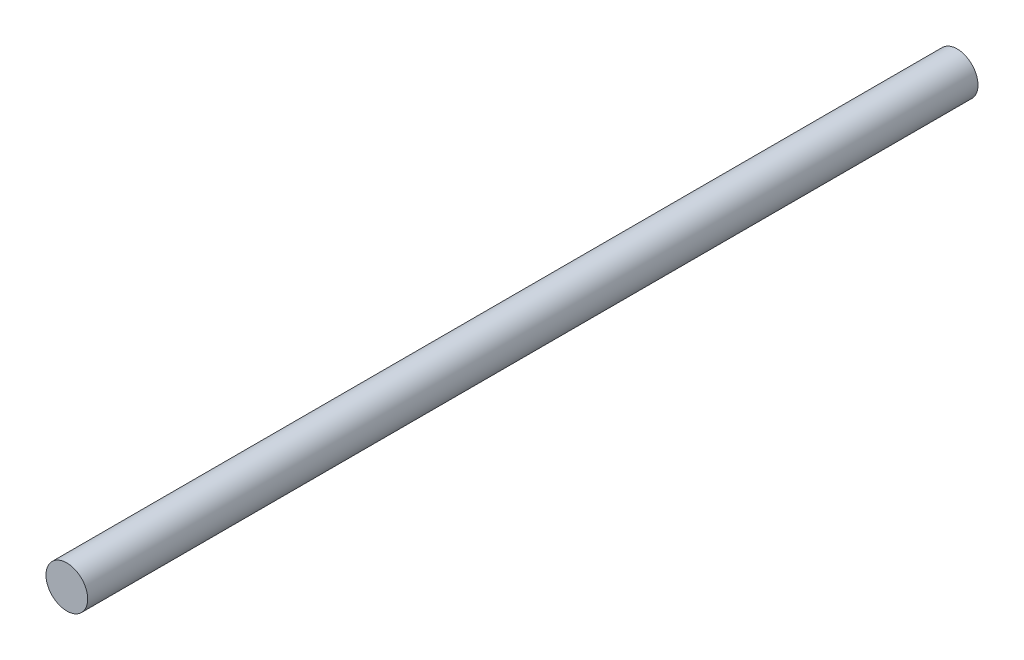
ISO-10303-21;
HEADER;
FILE_DESCRIPTION(('STEP AP214'),'2;1');
FILE_NAME('part.step','',(''),(''),'','','');
FILE_SCHEMA(('AUTOMOTIVE_DESIGN { 1 0 10303 214 1 1 1 1 }'));
ENDSEC;
DATA;
#1=APPLICATION_CONTEXT('core data for automotive mechanical design processes');
#2=APPLICATION_PROTOCOL_DEFINITION('international standard','automotive_design',2000,#1);
#3=PRODUCT_CONTEXT('',#1,'mechanical');
#4=PRODUCT('Part','Part','',(#3));
#5=PRODUCT_RELATED_PRODUCT_CATEGORY('part','',(#4));
#6=PRODUCT_DEFINITION_FORMATION('','',#4);
#7=PRODUCT_DEFINITION_CONTEXT('part definition',#1,'design');
#8=PRODUCT_DEFINITION('design','',#6,#7);
#9=PRODUCT_DEFINITION_SHAPE('','',#8);
#10=(LENGTH_UNIT() NAMED_UNIT(*) SI_UNIT(.MILLI.,.METRE.));
#11=(NAMED_UNIT(*) PLANE_ANGLE_UNIT() SI_UNIT($,.RADIAN.));
#12=(NAMED_UNIT(*) SI_UNIT($,.STERADIAN.) SOLID_ANGLE_UNIT());
#13=UNCERTAINTY_MEASURE_WITH_UNIT(LENGTH_MEASURE(1.E-05),#10,'distance_accuracy_value','');
#14=(GEOMETRIC_REPRESENTATION_CONTEXT(3) GLOBAL_UNCERTAINTY_ASSIGNED_CONTEXT((#13)) GLOBAL_UNIT_ASSIGNED_CONTEXT((#10,
#11,#12)) REPRESENTATION_CONTEXT('',''));
#15=CARTESIAN_POINT('',(0.,0.,0.));
#16=DIRECTION('',(0.,0.,1.));
#17=DIRECTION('',(1.,0.,0.));
#18=AXIS2_PLACEMENT_3D('',#15,#16,#17);
#19=CARTESIAN_POINT('',(0.,0.,32.));
#20=DIRECTION('',(0.,0.,-1.));
#21=DIRECTION('',(-1.,0.,0.));
#22=AXIS2_PLACEMENT_3D('',#19,#20,#21);
#23=CYLINDRICAL_SURFACE('',#22,0.75);
#24=CARTESIAN_POINT('',(0.,0.,32.));
#25=DIRECTION('',(0.,0.,1.));
#26=DIRECTION('',(1.,0.,0.));
#27=AXIS2_PLACEMENT_3D('',#24,#25,#26);
#28=CIRCLE('',#27,0.75);
#29=CARTESIAN_POINT('',(0.75,0.,32.));
#30=VERTEX_POINT('',#29);
#31=EDGE_CURVE('E10',#30,#30,#28,.T.);
#32=ORIENTED_EDGE('',*,*,#31,.F.);
#33=EDGE_LOOP('',(#32));
#34=FACE_BOUND('',#33,.T.);
#35=CARTESIAN_POINT('',(0.,0.,0.));
#36=DIRECTION('',(0.,0.,1.));
#37=DIRECTION('',(1.,0.,0.));
#38=AXIS2_PLACEMENT_3D('',#35,#36,#37);
#39=CIRCLE('',#38,0.75);
#40=CARTESIAN_POINT('',(0.75,0.,0.));
#41=VERTEX_POINT('',#40);
#42=EDGE_CURVE('E40',#41,#41,#39,.T.);
#43=ORIENTED_EDGE('',*,*,#42,.T.);
#44=EDGE_LOOP('',(#43));
#45=FACE_BOUND('',#44,.T.);
#46=ADVANCED_FACE('F37',(#34,#45),#23,.T.);
#47=CARTESIAN_POINT('',(0.,0.,32.));
#48=DIRECTION('',(0.,0.,1.));
#49=DIRECTION('',(1.,0.,0.));
#50=AXIS2_PLACEMENT_3D('',#47,#48,#49);
#51=PLANE('',#50);
#52=ORIENTED_EDGE('',*,*,#31,.T.);
#53=EDGE_LOOP('',(#52));
#54=FACE_BOUND('',#53,.T.);
#55=ADVANCED_FACE('F52',(#54),#51,.T.);
#56=CARTESIAN_POINT('',(0.,0.,0.));
#57=DIRECTION('',(0.,0.,1.));
#58=DIRECTION('',(1.,0.,0.));
#59=AXIS2_PLACEMENT_3D('',#56,#57,#58);
#60=PLANE('',#59);
#61=ORIENTED_EDGE('',*,*,#42,.F.);
#62=EDGE_LOOP('',(#61));
#63=FACE_BOUND('',#62,.T.);
#64=ADVANCED_FACE('F50',(#63),#60,.F.);
#65=CLOSED_SHELL('',(#46,#55,#64));
#66=MANIFOLD_SOLID_BREP('B2',#65);
#67=ADVANCED_BREP_SHAPE_REPRESENTATION('',(#18,#66),#14);
#68=SHAPE_DEFINITION_REPRESENTATION(#9,#67);
ENDSEC;
END-ISO-10303-21;
